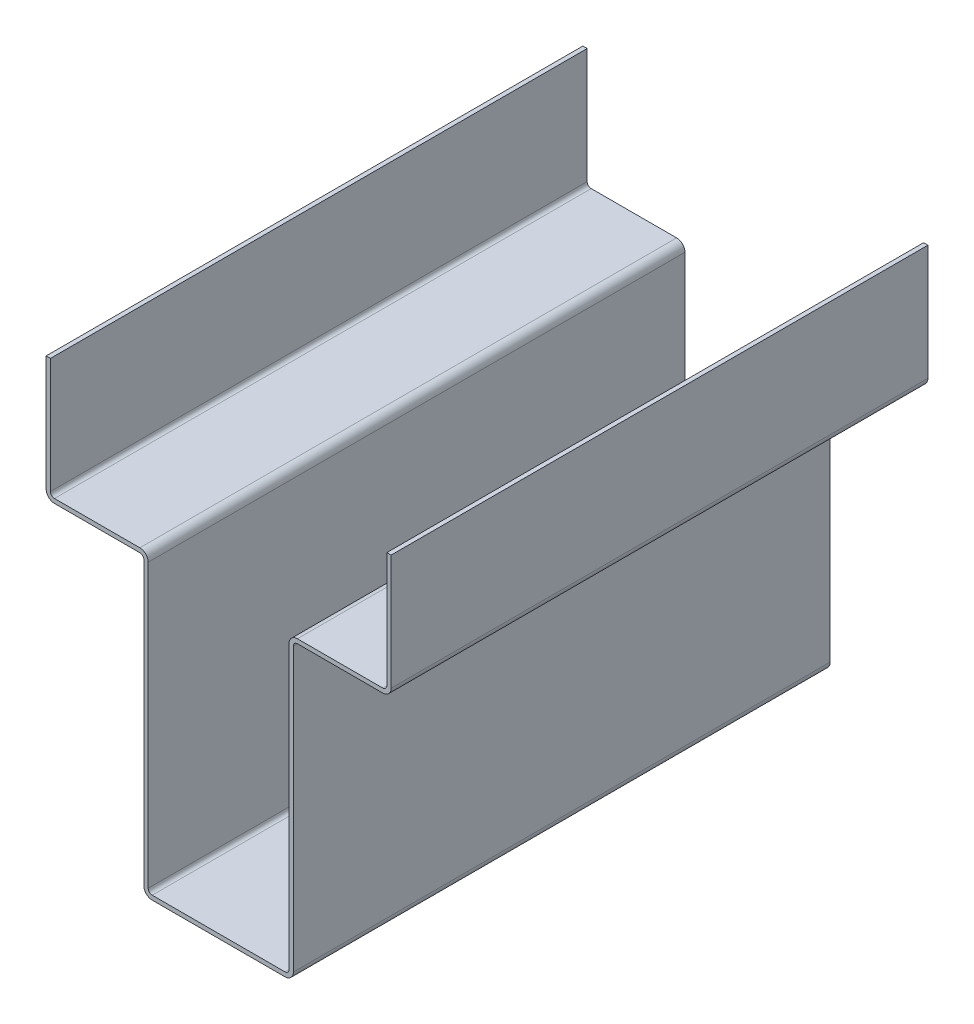
ISO-10303-21;
HEADER;
FILE_DESCRIPTION(('STEP AP214'),'2;1');
FILE_NAME('part.step','',(''),(''),'','','');
FILE_SCHEMA(('AUTOMOTIVE_DESIGN { 1 0 10303 214 1 1 1 1 }'));
ENDSEC;
DATA;
#1=APPLICATION_CONTEXT('core data for automotive mechanical design processes');
#2=APPLICATION_PROTOCOL_DEFINITION('international standard','automotive_design',2000,#1);
#3=PRODUCT_CONTEXT('',#1,'mechanical');
#4=PRODUCT('Part','Part','',(#3));
#5=PRODUCT_RELATED_PRODUCT_CATEGORY('part','',(#4));
#6=PRODUCT_DEFINITION_FORMATION('','',#4);
#7=PRODUCT_DEFINITION_CONTEXT('part definition',#1,'design');
#8=PRODUCT_DEFINITION('design','',#6,#7);
#9=PRODUCT_DEFINITION_SHAPE('','',#8);
#10=(LENGTH_UNIT() NAMED_UNIT(*) SI_UNIT(.MILLI.,.METRE.));
#11=(NAMED_UNIT(*) PLANE_ANGLE_UNIT() SI_UNIT($,.RADIAN.));
#12=(NAMED_UNIT(*) SI_UNIT($,.STERADIAN.) SOLID_ANGLE_UNIT());
#13=UNCERTAINTY_MEASURE_WITH_UNIT(LENGTH_MEASURE(1.E-05),#10,'distance_accuracy_value','');
#14=(GEOMETRIC_REPRESENTATION_CONTEXT(3) GLOBAL_UNCERTAINTY_ASSIGNED_CONTEXT((#13)) GLOBAL_UNIT_ASSIGNED_CONTEXT((#10,
#11,#12)) REPRESENTATION_CONTEXT('',''));
#15=CARTESIAN_POINT('',(0.,0.,0.));
#16=DIRECTION('',(0.,0.,1.));
#17=DIRECTION('',(1.,0.,0.));
#18=AXIS2_PLACEMENT_3D('',#15,#16,#17);
#19=CARTESIAN_POINT('',(58.5,146.302,97.084));
#20=DIRECTION('',(1.,0.,0.));
#21=DIRECTION('',(0.,-1.,0.));
#22=AXIS2_PLACEMENT_3D('',#19,#20,#21);
#23=PLANE('',#22);
#24=DIRECTION('',(0.,-1.,0.));
#25=VECTOR('',#24,1.);
#26=CARTESIAN_POINT('',(58.5000000000028,125.45,93.35));
#27=LINE('',#26,#25);
#28=CARTESIAN_POINT('',(58.5000000000028,145.5,93.35));
#29=VERTEX_POINT('',#28);
#30=CARTESIAN_POINT('',(58.5000000000014,105.400000000002,93.3499999999999));
#31=VERTEX_POINT('',#30);
#32=EDGE_CURVE('E218',#29,#31,#27,.T.);
#33=ORIENTED_EDGE('',*,*,#32,.F.);
#34=DIRECTION('',(0.,0.,1.));
#35=VECTOR('',#34,1.);
#36=CARTESIAN_POINT('',(58.5000000000028,145.5,0.));
#37=LINE('',#36,#35);
#38=CARTESIAN_POINT('',(58.5000000000028,145.5,-93.35));
#39=VERTEX_POINT('',#38);
#40=EDGE_CURVE('E204',#39,#29,#37,.T.);
#41=ORIENTED_EDGE('',*,*,#40,.F.);
#42=DIRECTION('',(0.,-1.,0.));
#43=VECTOR('',#42,1.);
#44=CARTESIAN_POINT('',(58.5000000000028,125.45,-93.35));
#45=LINE('',#44,#43);
#46=CARTESIAN_POINT('',(58.5000000000014,105.400000000002,-93.3499999999971));
#47=VERTEX_POINT('',#46);
#48=EDGE_CURVE('E199',#39,#47,#45,.T.);
#49=ORIENTED_EDGE('',*,*,#48,.T.);
#50=DIRECTION('',(0.,0.,-1.));
#51=VECTOR('',#50,1.);
#52=CARTESIAN_POINT('',(58.5,105.4,0.));
#53=LINE('',#52,#51);
#54=EDGE_CURVE('E202',#31,#47,#53,.T.);
#55=ORIENTED_EDGE('',*,*,#54,.F.);
#56=EDGE_LOOP('',(#33,#41,#49,#55));
#57=FACE_BOUND('',#56,.T.);
#58=ADVANCED_FACE('F16',(#57),#23,.F.);
#59=CARTESIAN_POINT('',(58.18154265341,145.5,-97.084));
#60=DIRECTION('',(0.,1.,0.));
#61=DIRECTION('',(0.,0.,1.));
#62=AXIS2_PLACEMENT_3D('',#59,#60,#61);
#63=PLANE('',#62);
#64=ORIENTED_EDGE('',*,*,#40,.T.);
#65=DIRECTION('',(-1.,0.,0.));
#66=VECTOR('',#65,1.);
#67=CARTESIAN_POINT('',(59.25,145.5,93.35));
#68=LINE('',#67,#66);
#69=CARTESIAN_POINT('',(60.,145.5,93.35));
#70=VERTEX_POINT('',#69);
#71=EDGE_CURVE('E312',#70,#29,#68,.T.);
#72=ORIENTED_EDGE('',*,*,#71,.F.);
#73=DIRECTION('',(0.,0.,1.));
#74=VECTOR('',#73,1.);
#75=CARTESIAN_POINT('',(60.,145.5,0.));
#76=LINE('',#75,#74);
#77=CARTESIAN_POINT('',(60.,145.5,-93.35));
#78=VERTEX_POINT('',#77);
#79=EDGE_CURVE('E228',#78,#70,#76,.T.);
#80=ORIENTED_EDGE('',*,*,#79,.F.);
#81=DIRECTION('',(-1.,0.,0.));
#82=VECTOR('',#81,1.);
#83=CARTESIAN_POINT('',(59.25,145.5,-93.35));
#84=LINE('',#83,#82);
#85=EDGE_CURVE('E208',#78,#39,#84,.T.);
#86=ORIENTED_EDGE('',*,*,#85,.T.);
#87=EDGE_LOOP('',(#64,#72,#80,#86));
#88=FACE_BOUND('',#87,.T.);
#89=ADVANCED_FACE('F502',(#88),#63,.T.);
#90=CARTESIAN_POINT('',(57.1,105.4,93.3499999999999));
#91=DIRECTION('',(0.,0.,-1.));
#92=DIRECTION('',(-1.,0.,0.));
#93=AXIS2_PLACEMENT_3D('',#90,#91,#92);
#94=CYLINDRICAL_SURFACE('',#93,1.4);
#95=CARTESIAN_POINT('',(57.1,105.4,93.3499999999999));
#96=DIRECTION('',(0.,0.,-1.));
#97=DIRECTION('',(-1.,0.,0.));
#98=AXIS2_PLACEMENT_3D('',#95,#96,#97);
#99=CIRCLE('',#98,1.4);
#100=CARTESIAN_POINT('',(57.1000000000021,104.000000000002,93.3499999999999));
#101=VERTEX_POINT('',#100);
#102=EDGE_CURVE('E217',#31,#101,#99,.T.);
#103=ORIENTED_EDGE('',*,*,#102,.F.);
#104=ORIENTED_EDGE('',*,*,#54,.T.);
#105=CARTESIAN_POINT('',(57.1,105.4,-93.3499999999941));
#106=DIRECTION('',(0.,0.,-1.));
#107=DIRECTION('',(-1.,0.,0.));
#108=AXIS2_PLACEMENT_3D('',#105,#106,#107);
#109=CIRCLE('',#108,1.4);
#110=CARTESIAN_POINT('',(57.1,104.000000000002,-93.3499999999971));
#111=VERTEX_POINT('',#110);
#112=EDGE_CURVE('E20',#47,#111,#109,.T.);
#113=ORIENTED_EDGE('',*,*,#112,.T.);
#114=DIRECTION('',(0.,0.,1.));
#115=VECTOR('',#114,1.);
#116=CARTESIAN_POINT('',(57.1,104.,0.));
#117=LINE('',#116,#115);
#118=EDGE_CURVE('E339',#111,#101,#117,.T.);
#119=ORIENTED_EDGE('',*,*,#118,.T.);
#120=EDGE_LOOP('',(#103,#104,#113,#119));
#121=FACE_BOUND('',#120,.T.);
#122=ADVANCED_FACE('F213',(#121),#94,.F.);
#123=CARTESIAN_POINT('',(60.,146.302,97.084));
#124=DIRECTION('',(1.,0.,0.));
#125=DIRECTION('',(0.,-1.,0.));
#126=AXIS2_PLACEMENT_3D('',#123,#124,#125);
#127=PLANE('',#126);
#128=DIRECTION('',(0.,-1.,0.));
#129=VECTOR('',#128,1.);
#130=CARTESIAN_POINT('',(60.,125.45,93.35));
#131=LINE('',#130,#129);
#132=CARTESIAN_POINT('',(60.,105.400000000002,93.3499999999999));
#133=VERTEX_POINT('',#132);
#134=EDGE_CURVE('E325',#70,#133,#131,.T.);
#135=ORIENTED_EDGE('',*,*,#134,.T.);
#136=DIRECTION('',(0.,0.,-1.));
#137=VECTOR('',#136,1.);
#138=CARTESIAN_POINT('',(60.,105.4,0.));
#139=LINE('',#138,#137);
#140=CARTESIAN_POINT('',(60.,105.400000000002,-93.349999999997));
#141=VERTEX_POINT('',#140);
#142=EDGE_CURVE('E235',#133,#141,#139,.T.);
#143=ORIENTED_EDGE('',*,*,#142,.T.);
#144=DIRECTION('',(0.,1.,0.));
#145=VECTOR('',#144,1.);
#146=CARTESIAN_POINT('',(60.,125.45,-93.35));
#147=LINE('',#146,#145);
#148=EDGE_CURVE('E225',#141,#78,#147,.T.);
#149=ORIENTED_EDGE('',*,*,#148,.T.);
#150=ORIENTED_EDGE('',*,*,#79,.T.);
#151=EDGE_LOOP('',(#135,#143,#149,#150));
#152=FACE_BOUND('',#151,.T.);
#153=ADVANCED_FACE('F499',(#152),#127,.T.);
#154=CARTESIAN_POINT('',(57.694,104.,97.084));
#155=DIRECTION('',(0.,-1.,0.));
#156=DIRECTION('',(-1.,0.,0.));
#157=AXIS2_PLACEMENT_3D('',#154,#155,#156);
#158=PLANE('',#157);
#159=DIRECTION('',(-1.,0.,0.));
#160=VECTOR('',#159,1.);
#161=CARTESIAN_POINT('',(42.25,104.000000000004,93.35));
#162=LINE('',#161,#160);
#163=CARTESIAN_POINT('',(27.4000000000004,104.000000000002,93.3499999999999));
#164=VERTEX_POINT('',#163);
#165=EDGE_CURVE('E334',#101,#164,#162,.T.);
#166=ORIENTED_EDGE('',*,*,#165,.F.);
#167=ORIENTED_EDGE('',*,*,#118,.F.);
#168=DIRECTION('',(-1.,0.,0.));
#169=VECTOR('',#168,1.);
#170=CARTESIAN_POINT('',(42.25,104.000000000004,-93.35));
#171=LINE('',#170,#169);
#172=CARTESIAN_POINT('',(27.3999999999984,104.000000000002,-93.3499999999971));
#173=VERTEX_POINT('',#172);
#174=EDGE_CURVE('E224',#111,#173,#171,.T.);
#175=ORIENTED_EDGE('',*,*,#174,.T.);
#176=DIRECTION('',(0.,0.,1.));
#177=VECTOR('',#176,1.);
#178=CARTESIAN_POINT('',(27.4000000000009,104.,0.));
#179=LINE('',#178,#177);
#180=EDGE_CURVE('E239',#173,#164,#179,.T.);
#181=ORIENTED_EDGE('',*,*,#180,.T.);
#182=EDGE_LOOP('',(#166,#167,#175,#181));
#183=FACE_BOUND('',#182,.T.);
#184=ADVANCED_FACE('F557',(#183),#158,.F.);
#185=CARTESIAN_POINT('',(57.1,105.4,93.3499999999999));
#186=DIRECTION('',(0.,0.,-1.));
#187=DIRECTION('',(-1.,0.,0.));
#188=AXIS2_PLACEMENT_3D('',#185,#186,#187);
#189=CYLINDRICAL_SURFACE('',#188,2.89999999999999);
#190=CARTESIAN_POINT('',(57.1,105.4,93.3499999999999));
#191=DIRECTION('',(0.,0.,-1.));
#192=DIRECTION('',(-1.,0.,0.));
#193=AXIS2_PLACEMENT_3D('',#190,#191,#192);
#194=CIRCLE('',#193,2.89999999999999);
#195=CARTESIAN_POINT('',(57.1000000000021,102.5,93.3499999999999));
#196=VERTEX_POINT('',#195);
#197=EDGE_CURVE('E233',#196,#133,#194,.F.);
#198=ORIENTED_EDGE('',*,*,#197,.F.);
#199=DIRECTION('',(0.,0.,1.));
#200=VECTOR('',#199,1.);
#201=CARTESIAN_POINT('',(57.1,102.5,0.));
#202=LINE('',#201,#200);
#203=CARTESIAN_POINT('',(57.1,102.5,-93.3499999999971));
#204=VERTEX_POINT('',#203);
#205=EDGE_CURVE('E343',#204,#196,#202,.T.);
#206=ORIENTED_EDGE('',*,*,#205,.F.);
#207=CARTESIAN_POINT('',(57.1,105.4,-93.3499999999941));
#208=DIRECTION('',(0.,0.,-1.));
#209=DIRECTION('',(-1.,0.,0.));
#210=AXIS2_PLACEMENT_3D('',#207,#208,#209);
#211=CIRCLE('',#210,2.89999999999999);
#212=EDGE_CURVE('E231',#141,#204,#211,.T.);
#213=ORIENTED_EDGE('',*,*,#212,.F.);
#214=ORIENTED_EDGE('',*,*,#142,.F.);
#215=EDGE_LOOP('',(#198,#206,#213,#214));
#216=FACE_BOUND('',#215,.T.);
#217=ADVANCED_FACE('F496',(#216),#189,.T.);
#218=CARTESIAN_POINT('',(27.4,101.1,93.3499999999999));
#219=DIRECTION('',(0.,0.,-1.));
#220=DIRECTION('',(-1.,0.,0.));
#221=AXIS2_PLACEMENT_3D('',#218,#219,#220);
#222=CYLINDRICAL_SURFACE('',#221,2.89999999999999);
#223=CARTESIAN_POINT('',(27.4,101.1,93.3499999999999));
#224=DIRECTION('',(0.,0.,-1.));
#225=DIRECTION('',(-1.,0.,0.));
#226=AXIS2_PLACEMENT_3D('',#223,#224,#225);
#227=CIRCLE('',#226,2.89999999999999);
#228=CARTESIAN_POINT('',(24.5000000000014,101.099999999998,93.3499999999999));
#229=VERTEX_POINT('',#228);
#230=EDGE_CURVE('E240',#164,#229,#227,.F.);
#231=ORIENTED_EDGE('',*,*,#230,.F.);
#232=ORIENTED_EDGE('',*,*,#180,.F.);
#233=CARTESIAN_POINT('',(27.4,101.1,-93.3499999999941));
#234=DIRECTION('',(0.,0.,-1.));
#235=DIRECTION('',(-1.,0.,0.));
#236=AXIS2_PLACEMENT_3D('',#233,#234,#235);
#237=CIRCLE('',#236,2.89999999999999);
#238=CARTESIAN_POINT('',(24.5000000000014,101.1,-93.3499999999971));
#239=VERTEX_POINT('',#238);
#240=EDGE_CURVE('E236',#173,#239,#237,.F.);
#241=ORIENTED_EDGE('',*,*,#240,.T.);
#242=DIRECTION('',(0.,0.,1.));
#243=VECTOR('',#242,1.);
#244=CARTESIAN_POINT('',(24.5,101.1,0.));
#245=LINE('',#244,#243);
#246=EDGE_CURVE('E243',#239,#229,#245,.T.);
#247=ORIENTED_EDGE('',*,*,#246,.T.);
#248=EDGE_LOOP('',(#231,#232,#241,#247));
#249=FACE_BOUND('',#248,.T.);
#250=ADVANCED_FACE('F556',(#249),#222,.T.);
#251=CARTESIAN_POINT('',(57.694,102.5,97.084));
#252=DIRECTION('',(0.,-1.,0.));
#253=DIRECTION('',(-1.,0.,0.));
#254=AXIS2_PLACEMENT_3D('',#251,#252,#253);
#255=PLANE('',#254);
#256=DIRECTION('',(-1.,0.,0.));
#257=VECTOR('',#256,1.);
#258=CARTESIAN_POINT('',(42.25,102.5,93.35));
#259=LINE('',#258,#257);
#260=CARTESIAN_POINT('',(27.4000000000002,102.5,93.3499999999999));
#261=VERTEX_POINT('',#260);
#262=EDGE_CURVE('E244',#196,#261,#259,.T.);
#263=ORIENTED_EDGE('',*,*,#262,.T.);
#264=DIRECTION('',(0.,0.,1.));
#265=VECTOR('',#264,1.);
#266=CARTESIAN_POINT('',(27.4000000000004,102.5,0.));
#267=LINE('',#266,#265);
#268=CARTESIAN_POINT('',(27.3999999999981,102.5,-93.349999999997));
#269=VERTEX_POINT('',#268);
#270=EDGE_CURVE('E248',#269,#261,#267,.T.);
#271=ORIENTED_EDGE('',*,*,#270,.F.);
#272=DIRECTION('',(1.,0.,0.));
#273=VECTOR('',#272,1.);
#274=CARTESIAN_POINT('',(42.25,102.5,-93.35));
#275=LINE('',#274,#273);
#276=EDGE_CURVE('E238',#269,#204,#275,.T.);
#277=ORIENTED_EDGE('',*,*,#276,.T.);
#278=ORIENTED_EDGE('',*,*,#205,.T.);
#279=EDGE_LOOP('',(#263,#271,#277,#278));
#280=FACE_BOUND('',#279,.T.);
#281=ADVANCED_FACE('F493',(#280),#255,.T.);
#282=CARTESIAN_POINT('',(24.5,103.064,97.084));
#283=DIRECTION('',(1.,0.,0.));
#284=DIRECTION('',(0.,-1.,0.));
#285=AXIS2_PLACEMENT_3D('',#282,#283,#284);
#286=PLANE('',#285);
#287=DIRECTION('',(0.,-1.,0.));
#288=VECTOR('',#287,1.);
#289=CARTESIAN_POINT('',(24.5000000000028,52.,93.35));
#290=LINE('',#289,#288);
#291=CARTESIAN_POINT('',(24.5000000000014,2.89999999999952,93.3499999999999));
#292=VERTEX_POINT('',#291);
#293=EDGE_CURVE('E252',#229,#292,#290,.T.);
#294=ORIENTED_EDGE('',*,*,#293,.F.);
#295=ORIENTED_EDGE('',*,*,#246,.F.);
#296=DIRECTION('',(0.,-1.,0.));
#297=VECTOR('',#296,1.);
#298=CARTESIAN_POINT('',(24.5000000000028,52.,-93.35));
#299=LINE('',#298,#297);
#300=CARTESIAN_POINT('',(24.5000000000014,2.89999999999952,-93.3499999999971));
#301=VERTEX_POINT('',#300);
#302=EDGE_CURVE('E249',#239,#301,#299,.T.);
#303=ORIENTED_EDGE('',*,*,#302,.T.);
#304=DIRECTION('',(0.,0.,-1.));
#305=VECTOR('',#304,1.);
#306=CARTESIAN_POINT('',(24.5,2.9,0.));
#307=LINE('',#306,#305);
#308=EDGE_CURVE('E256',#292,#301,#307,.T.);
#309=ORIENTED_EDGE('',*,*,#308,.F.);
#310=EDGE_LOOP('',(#294,#295,#303,#309));
#311=FACE_BOUND('',#310,.T.);
#312=ADVANCED_FACE('F550',(#311),#286,.F.);
#313=CARTESIAN_POINT('',(27.4,101.1,93.3499999999999));
#314=DIRECTION('',(0.,0.,-1.));
#315=DIRECTION('',(-1.,0.,0.));
#316=AXIS2_PLACEMENT_3D('',#313,#314,#315);
#317=CYLINDRICAL_SURFACE('',#316,1.4);
#318=CARTESIAN_POINT('',(27.4,101.1,93.3499999999999));
#319=DIRECTION('',(0.,0.,-1.));
#320=DIRECTION('',(-1.,0.,0.));
#321=AXIS2_PLACEMENT_3D('',#318,#319,#320);
#322=CIRCLE('',#321,1.4);
#323=CARTESIAN_POINT('',(26.,101.099999999998,93.3499999999999));
#324=VERTEX_POINT('',#323);
#325=EDGE_CURVE('E250',#261,#324,#322,.F.);
#326=ORIENTED_EDGE('',*,*,#325,.T.);
#327=DIRECTION('',(0.,0.,1.));
#328=VECTOR('',#327,1.);
#329=CARTESIAN_POINT('',(26.,101.1,0.));
#330=LINE('',#329,#328);
#331=CARTESIAN_POINT('',(26.,101.1,-93.3499999999971));
#332=VERTEX_POINT('',#331);
#333=EDGE_CURVE('E360',#332,#324,#330,.T.);
#334=ORIENTED_EDGE('',*,*,#333,.F.);
#335=CARTESIAN_POINT('',(27.4,101.1,-93.3499999999941));
#336=DIRECTION('',(0.,0.,-1.));
#337=DIRECTION('',(-1.,0.,0.));
#338=AXIS2_PLACEMENT_3D('',#335,#336,#337);
#339=CIRCLE('',#338,1.4);
#340=EDGE_CURVE('E245',#332,#269,#339,.T.);
#341=ORIENTED_EDGE('',*,*,#340,.T.);
#342=ORIENTED_EDGE('',*,*,#270,.T.);
#343=EDGE_LOOP('',(#326,#334,#341,#342));
#344=FACE_BOUND('',#343,.T.);
#345=ADVANCED_FACE('F488',(#344),#317,.F.);
#346=CARTESIAN_POINT('',(23.1,2.9,93.3499999999999));
#347=DIRECTION('',(0.,0.,-1.));
#348=DIRECTION('',(-1.,0.,0.));
#349=AXIS2_PLACEMENT_3D('',#346,#347,#348);
#350=CYLINDRICAL_SURFACE('',#349,1.4);
#351=CARTESIAN_POINT('',(23.1,2.9,93.3499999999999));
#352=DIRECTION('',(0.,0.,-1.));
#353=DIRECTION('',(-1.,0.,0.));
#354=AXIS2_PLACEMENT_3D('',#351,#352,#353);
#355=CIRCLE('',#354,1.4);
#356=CARTESIAN_POINT('',(23.1000000000021,1.49999999999996,93.3499999999999));
#357=VERTEX_POINT('',#356);
#358=EDGE_CURVE('E255',#292,#357,#355,.T.);
#359=ORIENTED_EDGE('',*,*,#358,.F.);
#360=ORIENTED_EDGE('',*,*,#308,.T.);
#361=CARTESIAN_POINT('',(23.1,2.9,-93.3499999999941));
#362=DIRECTION('',(0.,0.,-1.));
#363=DIRECTION('',(-1.,0.,0.));
#364=AXIS2_PLACEMENT_3D('',#361,#362,#363);
#365=CIRCLE('',#364,1.4);
#366=CARTESIAN_POINT('',(23.1,1.49999999999994,-93.3499999999971));
#367=VERTEX_POINT('',#366);
#368=EDGE_CURVE('E253',#301,#367,#365,.T.);
#369=ORIENTED_EDGE('',*,*,#368,.T.);
#370=DIRECTION('',(0.,0.,1.));
#371=VECTOR('',#370,1.);
#372=CARTESIAN_POINT('',(23.1,1.5,0.));
#373=LINE('',#372,#371);
#374=EDGE_CURVE('E371',#367,#357,#373,.T.);
#375=ORIENTED_EDGE('',*,*,#374,.T.);
#376=EDGE_LOOP('',(#359,#360,#369,#375));
#377=FACE_BOUND('',#376,.T.);
#378=ADVANCED_FACE('F549',(#377),#350,.F.);
#379=CARTESIAN_POINT('',(26.,103.064,97.084));
#380=DIRECTION('',(1.,0.,0.));
#381=DIRECTION('',(0.,-1.,0.));
#382=AXIS2_PLACEMENT_3D('',#379,#380,#381);
#383=PLANE('',#382);
#384=DIRECTION('',(0.,-1.,0.));
#385=VECTOR('',#384,1.);
#386=CARTESIAN_POINT('',(26.,52.,93.35));
#387=LINE('',#386,#385);
#388=CARTESIAN_POINT('',(26.,2.89999999999952,93.3499999999999));
#389=VERTEX_POINT('',#388);
#390=EDGE_CURVE('E363',#324,#389,#387,.T.);
#391=ORIENTED_EDGE('',*,*,#390,.T.);
#392=DIRECTION('',(0.,0.,-1.));
#393=VECTOR('',#392,1.);
#394=CARTESIAN_POINT('',(26.,2.9,0.));
#395=LINE('',#394,#393);
#396=CARTESIAN_POINT('',(26.,2.89999999999952,-93.349999999997));
#397=VERTEX_POINT('',#396);
#398=EDGE_CURVE('E265',#389,#397,#395,.T.);
#399=ORIENTED_EDGE('',*,*,#398,.T.);
#400=DIRECTION('',(0.,1.,0.));
#401=VECTOR('',#400,1.);
#402=CARTESIAN_POINT('',(26.,52.,-93.35));
#403=LINE('',#402,#401);
#404=EDGE_CURVE('E259',#397,#332,#403,.T.);
#405=ORIENTED_EDGE('',*,*,#404,.T.);
#406=ORIENTED_EDGE('',*,*,#333,.T.);
#407=EDGE_LOOP('',(#391,#399,#405,#406));
#408=FACE_BOUND('',#407,.T.);
#409=ADVANCED_FACE('F482',(#408),#383,.T.);
#410=CARTESIAN_POINT('',(24.024,1.5,97.084));
#411=DIRECTION('',(0.,-1.,0.));
#412=DIRECTION('',(-1.,0.,0.));
#413=AXIS2_PLACEMENT_3D('',#410,#411,#412);
#414=PLANE('',#413);
#415=DIRECTION('',(-1.,0.,0.));
#416=VECTOR('',#415,1.);
#417=CARTESIAN_POINT('',(0.,1.49999999999993,93.35));
#418=LINE('',#417,#416);
#419=CARTESIAN_POINT('',(-23.1000000000021,1.49999999999993,93.3499999999999));
#420=VERTEX_POINT('',#419);
#421=EDGE_CURVE('E368',#357,#420,#418,.T.);
#422=ORIENTED_EDGE('',*,*,#421,.F.);
#423=ORIENTED_EDGE('',*,*,#374,.F.);
#424=DIRECTION('',(-1.,0.,0.));
#425=VECTOR('',#424,1.);
#426=CARTESIAN_POINT('',(0.,1.49999999999993,-93.35));
#427=LINE('',#426,#425);
#428=CARTESIAN_POINT('',(-23.1000000000021,1.49999999999993,-93.3499999999971));
#429=VERTEX_POINT('',#428);
#430=EDGE_CURVE('E263',#367,#429,#427,.T.);
#431=ORIENTED_EDGE('',*,*,#430,.T.);
#432=DIRECTION('',(0.,0.,-1.));
#433=VECTOR('',#432,1.);
#434=CARTESIAN_POINT('',(-23.1000000000001,1.5,0.));
#435=LINE('',#434,#433);
#436=EDGE_CURVE('E269',#420,#429,#435,.T.);
#437=ORIENTED_EDGE('',*,*,#436,.F.);
#438=EDGE_LOOP('',(#422,#423,#431,#437));
#439=FACE_BOUND('',#438,.T.);
#440=ADVANCED_FACE('F543',(#439),#414,.F.);
#441=CARTESIAN_POINT('',(23.1,2.9,93.3499999999999));
#442=DIRECTION('',(0.,0.,-1.));
#443=DIRECTION('',(-1.,0.,0.));
#444=AXIS2_PLACEMENT_3D('',#441,#442,#443);
#445=CYLINDRICAL_SURFACE('',#444,2.90000000000001);
#446=CARTESIAN_POINT('',(23.1,2.9,93.3499999999999));
#447=DIRECTION('',(0.,0.,-1.));
#448=DIRECTION('',(-1.,0.,0.));
#449=AXIS2_PLACEMENT_3D('',#446,#447,#448);
#450=CIRCLE('',#449,2.90000000000001);
#451=CARTESIAN_POINT('',(23.1000000000021,0.,93.3499999999999));
#452=VERTEX_POINT('',#451);
#453=EDGE_CURVE('E262',#452,#389,#450,.F.);
#454=ORIENTED_EDGE('',*,*,#453,.F.);
#455=DIRECTION('',(0.,0.,1.));
#456=VECTOR('',#455,1.);
#457=CARTESIAN_POINT('',(23.1,0.,0.));
#458=LINE('',#457,#456);
#459=CARTESIAN_POINT('',(23.1,0.,-93.3499999999971));
#460=VERTEX_POINT('',#459);
#461=EDGE_CURVE('E379',#460,#452,#458,.T.);
#462=ORIENTED_EDGE('',*,*,#461,.F.);
#463=CARTESIAN_POINT('',(23.1,2.9,-93.3499999999941));
#464=DIRECTION('',(0.,0.,-1.));
#465=DIRECTION('',(-1.,0.,0.));
#466=AXIS2_PLACEMENT_3D('',#463,#464,#465);
#467=CIRCLE('',#466,2.90000000000001);
#468=EDGE_CURVE('E260',#397,#460,#467,.T.);
#469=ORIENTED_EDGE('',*,*,#468,.F.);
#470=ORIENTED_EDGE('',*,*,#398,.F.);
#471=EDGE_LOOP('',(#454,#462,#469,#470));
#472=FACE_BOUND('',#471,.T.);
#473=ADVANCED_FACE('F485',(#472),#445,.T.);
#474=CARTESIAN_POINT('',(-23.1,2.9,93.3499999999999));
#475=DIRECTION('',(0.,0.,-1.));
#476=DIRECTION('',(-1.,0.,0.));
#477=AXIS2_PLACEMENT_3D('',#474,#475,#476);
#478=CYLINDRICAL_SURFACE('',#477,1.4);
#479=CARTESIAN_POINT('',(-23.1,2.9,93.3499999999999));
#480=DIRECTION('',(0.,0.,-1.));
#481=DIRECTION('',(-1.,0.,0.));
#482=AXIS2_PLACEMENT_3D('',#479,#480,#481);
#483=CIRCLE('',#482,1.4);
#484=CARTESIAN_POINT('',(-24.5000000000014,2.89999999999952,93.3499999999999));
#485=VERTEX_POINT('',#484);
#486=EDGE_CURVE('E268',#420,#485,#483,.T.);
#487=ORIENTED_EDGE('',*,*,#486,.F.);
#488=ORIENTED_EDGE('',*,*,#436,.T.);
#489=CARTESIAN_POINT('',(-23.1,2.9,-93.3499999999941));
#490=DIRECTION('',(0.,0.,-1.));
#491=DIRECTION('',(-1.,0.,0.));
#492=AXIS2_PLACEMENT_3D('',#489,#490,#491);
#493=CIRCLE('',#492,1.4);
#494=CARTESIAN_POINT('',(-24.5000000000014,2.9,-93.3499999999971));
#495=VERTEX_POINT('',#494);
#496=EDGE_CURVE('E266',#429,#495,#493,.T.);
#497=ORIENTED_EDGE('',*,*,#496,.T.);
#498=DIRECTION('',(0.,0.,1.));
#499=VECTOR('',#498,1.);
#500=CARTESIAN_POINT('',(-24.5,2.9,0.));
#501=LINE('',#500,#499);
#502=EDGE_CURVE('E390',#495,#485,#501,.T.);
#503=ORIENTED_EDGE('',*,*,#502,.T.);
#504=EDGE_LOOP('',(#487,#488,#497,#503));
#505=FACE_BOUND('',#504,.T.);
#506=ADVANCED_FACE('F542',(#505),#478,.F.);
#507=CARTESIAN_POINT('',(24.024,0.,97.084));
#508=DIRECTION('',(0.,-1.,0.));
#509=DIRECTION('',(-1.,0.,0.));
#510=AXIS2_PLACEMENT_3D('',#507,#508,#509);
#511=PLANE('',#510);
#512=DIRECTION('',(-1.,0.,0.));
#513=VECTOR('',#512,1.);
#514=CARTESIAN_POINT('',(0.,0.,93.35));
#515=LINE('',#514,#513);
#516=CARTESIAN_POINT('',(-23.1000000000021,0.,93.3499999999999));
#517=VERTEX_POINT('',#516);
#518=EDGE_CURVE('E382',#452,#517,#515,.T.);
#519=ORIENTED_EDGE('',*,*,#518,.T.);
#520=DIRECTION('',(0.,0.,-1.));
#521=VECTOR('',#520,1.);
#522=CARTESIAN_POINT('',(-23.1000000000003,0.,0.));
#523=LINE('',#522,#521);
#524=CARTESIAN_POINT('',(-23.1000000000021,0.,-93.349999999997));
#525=VERTEX_POINT('',#524);
#526=EDGE_CURVE('E278',#517,#525,#523,.T.);
#527=ORIENTED_EDGE('',*,*,#526,.T.);
#528=DIRECTION('',(1.,0.,0.));
#529=VECTOR('',#528,1.);
#530=CARTESIAN_POINT('',(0.,0.,-93.35));
#531=LINE('',#530,#529);
#532=EDGE_CURVE('E272',#525,#460,#531,.T.);
#533=ORIENTED_EDGE('',*,*,#532,.T.);
#534=ORIENTED_EDGE('',*,*,#461,.T.);
#535=EDGE_LOOP('',(#519,#527,#533,#534));
#536=FACE_BOUND('',#535,.T.);
#537=ADVANCED_FACE('F475',(#536),#511,.T.);
#538=CARTESIAN_POINT('',(-24.5,0.936,97.084));
#539=DIRECTION('',(-1.,0.,0.));
#540=DIRECTION('',(0.,1.,0.));
#541=AXIS2_PLACEMENT_3D('',#538,#539,#540);
#542=PLANE('',#541);
#543=DIRECTION('',(0.,1.,0.));
#544=VECTOR('',#543,1.);
#545=CARTESIAN_POINT('',(-24.5000000000028,52.,93.35));
#546=LINE('',#545,#544);
#547=CARTESIAN_POINT('',(-24.5000000000014,101.099999999999,93.3499999999999));
#548=VERTEX_POINT('',#547);
#549=EDGE_CURVE('E387',#485,#548,#546,.T.);
#550=ORIENTED_EDGE('',*,*,#549,.F.);
#551=ORIENTED_EDGE('',*,*,#502,.F.);
#552=DIRECTION('',(0.,1.,0.));
#553=VECTOR('',#552,1.);
#554=CARTESIAN_POINT('',(-24.5000000000028,52.,-93.35));
#555=LINE('',#554,#553);
#556=CARTESIAN_POINT('',(-24.5000000000028,101.099999999998,-93.3499999999971));
#557=VERTEX_POINT('',#556);
#558=EDGE_CURVE('E276',#495,#557,#555,.T.);
#559=ORIENTED_EDGE('',*,*,#558,.T.);
#560=DIRECTION('',(0.,0.,1.));
#561=VECTOR('',#560,1.);
#562=CARTESIAN_POINT('',(-24.5,101.099999999999,0.));
#563=LINE('',#562,#561);
#564=EDGE_CURVE('E282',#557,#548,#563,.T.);
#565=ORIENTED_EDGE('',*,*,#564,.T.);
#566=EDGE_LOOP('',(#550,#551,#559,#565));
#567=FACE_BOUND('',#566,.T.);
#568=ADVANCED_FACE('F536',(#567),#542,.F.);
#569=CARTESIAN_POINT('',(-23.1,2.9,93.3499999999999));
#570=DIRECTION('',(0.,0.,-1.));
#571=DIRECTION('',(-1.,0.,0.));
#572=AXIS2_PLACEMENT_3D('',#569,#570,#571);
#573=CYLINDRICAL_SURFACE('',#572,2.9);
#574=CARTESIAN_POINT('',(-23.1,2.9,93.3499999999999));
#575=DIRECTION('',(0.,0.,-1.));
#576=DIRECTION('',(-1.,0.,0.));
#577=AXIS2_PLACEMENT_3D('',#574,#575,#576);
#578=CIRCLE('',#577,2.9);
#579=CARTESIAN_POINT('',(-26.,2.89999999999952,93.3499999999999));
#580=VERTEX_POINT('',#579);
#581=EDGE_CURVE('E275',#580,#517,#578,.F.);
#582=ORIENTED_EDGE('',*,*,#581,.F.);
#583=DIRECTION('',(0.,0.,1.));
#584=VECTOR('',#583,1.);
#585=CARTESIAN_POINT('',(-26.,2.9,0.));
#586=LINE('',#585,#584);
#587=CARTESIAN_POINT('',(-26.,2.9,-93.3499999999971));
#588=VERTEX_POINT('',#587);
#589=EDGE_CURVE('E396',#588,#580,#586,.T.);
#590=ORIENTED_EDGE('',*,*,#589,.F.);
#591=CARTESIAN_POINT('',(-23.1,2.9,-93.3499999999941));
#592=DIRECTION('',(0.,0.,-1.));
#593=DIRECTION('',(-1.,0.,0.));
#594=AXIS2_PLACEMENT_3D('',#591,#592,#593);
#595=CIRCLE('',#594,2.9);
#596=EDGE_CURVE('E273',#525,#588,#595,.T.);
#597=ORIENTED_EDGE('',*,*,#596,.F.);
#598=ORIENTED_EDGE('',*,*,#526,.F.);
#599=EDGE_LOOP('',(#582,#590,#597,#598));
#600=FACE_BOUND('',#599,.T.);
#601=ADVANCED_FACE('F472',(#600),#573,.T.);
#602=CARTESIAN_POINT('',(-27.4,101.1,93.3499999999999));
#603=DIRECTION('',(0.,0.,-1.));
#604=DIRECTION('',(-1.,0.,0.));
#605=AXIS2_PLACEMENT_3D('',#602,#603,#604);
#606=CYLINDRICAL_SURFACE('',#605,2.90000000000001);
#607=CARTESIAN_POINT('',(-27.4,101.1,93.3499999999999));
#608=DIRECTION('',(0.,0.,-1.));
#609=DIRECTION('',(-1.,0.,0.));
#610=AXIS2_PLACEMENT_3D('',#607,#608,#609);
#611=CIRCLE('',#610,2.90000000000001);
#612=CARTESIAN_POINT('',(-27.3999999999979,104.000000000002,93.3499999999999));
#613=VERTEX_POINT('',#612);
#614=EDGE_CURVE('E283',#548,#613,#611,.F.);
#615=ORIENTED_EDGE('',*,*,#614,.F.);
#616=ORIENTED_EDGE('',*,*,#564,.F.);
#617=CARTESIAN_POINT('',(-27.4,101.1,-93.3499999999941));
#618=DIRECTION('',(0.,0.,-1.));
#619=DIRECTION('',(-1.,0.,0.));
#620=AXIS2_PLACEMENT_3D('',#617,#618,#619);
#621=CIRCLE('',#620,2.90000000000001);
#622=CARTESIAN_POINT('',(-27.4,104.000000000002,-93.3499999999971));
#623=VERTEX_POINT('',#622);
#624=EDGE_CURVE('E279',#557,#623,#621,.F.);
#625=ORIENTED_EDGE('',*,*,#624,.T.);
#626=DIRECTION('',(0.,0.,1.));
#627=VECTOR('',#626,1.);
#628=CARTESIAN_POINT('',(-27.4,104.,0.));
#629=LINE('',#628,#627);
#630=EDGE_CURVE('E286',#623,#613,#629,.T.);
#631=ORIENTED_EDGE('',*,*,#630,.T.);
#632=EDGE_LOOP('',(#615,#616,#625,#631));
#633=FACE_BOUND('',#632,.T.);
#634=ADVANCED_FACE('F535',(#633),#606,.T.);
#635=CARTESIAN_POINT('',(-26.,0.936,97.084));
#636=DIRECTION('',(-1.,0.,0.));
#637=DIRECTION('',(0.,1.,0.));
#638=AXIS2_PLACEMENT_3D('',#635,#636,#637);
#639=PLANE('',#638);
#640=DIRECTION('',(0.,1.,0.));
#641=VECTOR('',#640,1.);
#642=CARTESIAN_POINT('',(-26.,52.,93.35));
#643=LINE('',#642,#641);
#644=CARTESIAN_POINT('',(-26.,101.1,93.3499999999999));
#645=VERTEX_POINT('',#644);
#646=EDGE_CURVE('E287',#580,#645,#643,.T.);
#647=ORIENTED_EDGE('',*,*,#646,.T.);
#648=DIRECTION('',(0.,0.,1.));
#649=VECTOR('',#648,1.);
#650=CARTESIAN_POINT('',(-26.,101.099999999999,0.));
#651=LINE('',#650,#649);
#652=CARTESIAN_POINT('',(-26.,101.099999999998,-93.349999999997));
#653=VERTEX_POINT('',#652);
#654=EDGE_CURVE('E291',#653,#645,#651,.T.);
#655=ORIENTED_EDGE('',*,*,#654,.F.);
#656=DIRECTION('',(0.,-1.,0.));
#657=VECTOR('',#656,1.);
#658=CARTESIAN_POINT('',(-26.,52.,-93.35));
#659=LINE('',#658,#657);
#660=EDGE_CURVE('E281',#653,#588,#659,.T.);
#661=ORIENTED_EDGE('',*,*,#660,.T.);
#662=ORIENTED_EDGE('',*,*,#589,.T.);
#663=EDGE_LOOP('',(#647,#655,#661,#662));
#664=FACE_BOUND('',#663,.T.);
#665=ADVANCED_FACE('F469',(#664),#639,.T.);
#666=CARTESIAN_POINT('',(-26.806,104.,97.084));
#667=DIRECTION('',(0.,-1.,0.));
#668=DIRECTION('',(-1.,0.,0.));
#669=AXIS2_PLACEMENT_3D('',#666,#667,#668);
#670=PLANE('',#669);
#671=DIRECTION('',(-1.,0.,0.));
#672=VECTOR('',#671,1.);
#673=CARTESIAN_POINT('',(-42.25,104.000000000004,93.35));
#674=LINE('',#673,#672);
#675=CARTESIAN_POINT('',(-57.1000000000022,104.000000000002,93.3499999999999));
#676=VERTEX_POINT('',#675);
#677=EDGE_CURVE('E295',#613,#676,#674,.T.);
#678=ORIENTED_EDGE('',*,*,#677,.F.);
#679=ORIENTED_EDGE('',*,*,#630,.F.);
#680=DIRECTION('',(-1.,0.,0.));
#681=VECTOR('',#680,1.);
#682=CARTESIAN_POINT('',(-42.25,104.000000000004,-93.35));
#683=LINE('',#682,#681);
#684=CARTESIAN_POINT('',(-57.1000000000022,104.000000000002,-93.3499999999971));
#685=VERTEX_POINT('',#684);
#686=EDGE_CURVE('E292',#623,#685,#683,.T.);
#687=ORIENTED_EDGE('',*,*,#686,.T.);
#688=DIRECTION('',(0.,0.,-1.));
#689=VECTOR('',#688,1.);
#690=CARTESIAN_POINT('',(-57.1000000000002,104.,0.));
#691=LINE('',#690,#689);
#692=EDGE_CURVE('E299',#676,#685,#691,.T.);
#693=ORIENTED_EDGE('',*,*,#692,.F.);
#694=EDGE_LOOP('',(#678,#679,#687,#693));
#695=FACE_BOUND('',#694,.T.);
#696=ADVANCED_FACE('F529',(#695),#670,.F.);
#697=CARTESIAN_POINT('',(-27.4,101.1,93.3499999999999));
#698=DIRECTION('',(0.,0.,-1.));
#699=DIRECTION('',(-1.,0.,0.));
#700=AXIS2_PLACEMENT_3D('',#697,#698,#699);
#701=CYLINDRICAL_SURFACE('',#700,1.4);
#702=CARTESIAN_POINT('',(-27.4,101.1,93.3499999999999));
#703=DIRECTION('',(0.,0.,-1.));
#704=DIRECTION('',(-1.,0.,0.));
#705=AXIS2_PLACEMENT_3D('',#702,#703,#704);
#706=CIRCLE('',#705,1.4);
#707=CARTESIAN_POINT('',(-27.3999999999979,102.5,93.3499999999999));
#708=VERTEX_POINT('',#707);
#709=EDGE_CURVE('E293',#645,#708,#706,.F.);
#710=ORIENTED_EDGE('',*,*,#709,.T.);
#711=DIRECTION('',(0.,0.,1.));
#712=VECTOR('',#711,1.);
#713=CARTESIAN_POINT('',(-27.4,102.5,0.));
#714=LINE('',#713,#712);
#715=CARTESIAN_POINT('',(-27.4,102.5,-93.3499999999971));
#716=VERTEX_POINT('',#715);
#717=EDGE_CURVE('E413',#716,#708,#714,.T.);
#718=ORIENTED_EDGE('',*,*,#717,.F.);
#719=CARTESIAN_POINT('',(-27.4,101.1,-93.3499999999941));
#720=DIRECTION('',(0.,0.,-1.));
#721=DIRECTION('',(-1.,0.,0.));
#722=AXIS2_PLACEMENT_3D('',#719,#720,#721);
#723=CIRCLE('',#722,1.4);
#724=EDGE_CURVE('E288',#716,#653,#723,.T.);
#725=ORIENTED_EDGE('',*,*,#724,.T.);
#726=ORIENTED_EDGE('',*,*,#654,.T.);
#727=EDGE_LOOP('',(#710,#718,#725,#726));
#728=FACE_BOUND('',#727,.T.);
#729=ADVANCED_FACE('F464',(#728),#701,.F.);
#730=CARTESIAN_POINT('',(-57.1,105.4,93.3499999999999));
#731=DIRECTION('',(0.,0.,-1.));
#732=DIRECTION('',(-1.,0.,0.));
#733=AXIS2_PLACEMENT_3D('',#730,#731,#732);
#734=CYLINDRICAL_SURFACE('',#733,1.4);
#735=CARTESIAN_POINT('',(-57.1,105.4,93.3499999999999));
#736=DIRECTION('',(0.,0.,-1.));
#737=DIRECTION('',(-1.,0.,0.));
#738=AXIS2_PLACEMENT_3D('',#735,#736,#737);
#739=CIRCLE('',#738,1.4);
#740=CARTESIAN_POINT('',(-58.5000000000014,105.400000000002,93.3499999999999));
#741=VERTEX_POINT('',#740);
#742=EDGE_CURVE('E298',#676,#741,#739,.T.);
#743=ORIENTED_EDGE('',*,*,#742,.F.);
#744=ORIENTED_EDGE('',*,*,#692,.T.);
#745=CARTESIAN_POINT('',(-57.1,105.4,-93.3499999999941));
#746=DIRECTION('',(0.,0.,-1.));
#747=DIRECTION('',(-1.,0.,0.));
#748=AXIS2_PLACEMENT_3D('',#745,#746,#747);
#749=CIRCLE('',#748,1.4);
#750=CARTESIAN_POINT('',(-58.5000000000014,105.4,-93.3499999999971));
#751=VERTEX_POINT('',#750);
#752=EDGE_CURVE('E296',#685,#751,#749,.T.);
#753=ORIENTED_EDGE('',*,*,#752,.T.);
#754=DIRECTION('',(0.,0.,1.));
#755=VECTOR('',#754,1.);
#756=CARTESIAN_POINT('',(-58.5,105.4,0.));
#757=LINE('',#756,#755);
#758=EDGE_CURVE('E421',#751,#741,#757,.T.);
#759=ORIENTED_EDGE('',*,*,#758,.T.);
#760=EDGE_LOOP('',(#743,#744,#753,#759));
#761=FACE_BOUND('',#760,.T.);
#762=ADVANCED_FACE('F528',(#761),#734,.F.);
#763=CARTESIAN_POINT('',(-26.806,102.5,97.084));
#764=DIRECTION('',(0.,-1.,0.));
#765=DIRECTION('',(-1.,0.,0.));
#766=AXIS2_PLACEMENT_3D('',#763,#764,#765);
#767=PLANE('',#766);
#768=DIRECTION('',(-1.,0.,0.));
#769=VECTOR('',#768,1.);
#770=CARTESIAN_POINT('',(-42.25,102.5,93.35));
#771=LINE('',#770,#769);
#772=CARTESIAN_POINT('',(-57.1000000000021,102.5,93.35));
#773=VERTEX_POINT('',#772);
#774=EDGE_CURVE('E416',#708,#773,#771,.T.);
#775=ORIENTED_EDGE('',*,*,#774,.T.);
#776=DIRECTION('',(0.,0.,-1.));
#777=VECTOR('',#776,1.);
#778=CARTESIAN_POINT('',(-57.1000000000003,102.5,0.));
#779=LINE('',#778,#777);
#780=CARTESIAN_POINT('',(-57.1000000000021,102.5,-93.3499999999985));
#781=VERTEX_POINT('',#780);
#782=EDGE_CURVE('E308',#773,#781,#779,.T.);
#783=ORIENTED_EDGE('',*,*,#782,.T.);
#784=DIRECTION('',(1.,0.,0.));
#785=VECTOR('',#784,1.);
#786=CARTESIAN_POINT('',(-42.25,102.5,-93.35));
#787=LINE('',#786,#785);
#788=EDGE_CURVE('E302',#781,#716,#787,.T.);
#789=ORIENTED_EDGE('',*,*,#788,.T.);
#790=ORIENTED_EDGE('',*,*,#717,.T.);
#791=EDGE_LOOP('',(#775,#783,#789,#790));
#792=FACE_BOUND('',#791,.T.);
#793=ADVANCED_FACE('F458',(#792),#767,.T.);
#794=CARTESIAN_POINT('',(-58.5,104.598,97.084));
#795=DIRECTION('',(-1.,0.,0.));
#796=DIRECTION('',(0.,1.,0.));
#797=AXIS2_PLACEMENT_3D('',#794,#795,#796);
#798=PLANE('',#797);
#799=DIRECTION('',(0.,1.,0.));
#800=VECTOR('',#799,1.);
#801=CARTESIAN_POINT('',(-58.5000000000028,125.45,93.35));
#802=LINE('',#801,#800);
#803=CARTESIAN_POINT('',(-58.5000000000014,145.5,93.35));
#804=VERTEX_POINT('',#803);
#805=EDGE_CURVE('E417',#741,#804,#802,.T.);
#806=ORIENTED_EDGE('',*,*,#805,.F.);
#807=ORIENTED_EDGE('',*,*,#758,.F.);
#808=DIRECTION('',(0.,1.,0.));
#809=VECTOR('',#808,1.);
#810=CARTESIAN_POINT('',(-58.5000000000028,125.45,-93.35));
#811=LINE('',#810,#809);
#812=CARTESIAN_POINT('',(-58.5000000000021,145.5,-93.35));
#813=VERTEX_POINT('',#812);
#814=EDGE_CURVE('E306',#751,#813,#811,.T.);
#815=ORIENTED_EDGE('',*,*,#814,.T.);
#816=DIRECTION('',(0.,0.,1.));
#817=VECTOR('',#816,1.);
#818=CARTESIAN_POINT('',(-58.5000000000028,145.5,0.));
#819=LINE('',#818,#817);
#820=EDGE_CURVE('E440',#813,#804,#819,.T.);
#821=ORIENTED_EDGE('',*,*,#820,.T.);
#822=EDGE_LOOP('',(#806,#807,#815,#821));
#823=FACE_BOUND('',#822,.T.);
#824=ADVANCED_FACE('F444',(#823),#798,.F.);
#825=CARTESIAN_POINT('',(-58.18154265341,104.598,-93.35));
#826=DIRECTION('',(0.,0.,1.));
#827=DIRECTION('',(0.,1.,0.));
#828=AXIS2_PLACEMENT_3D('',#825,#826,#827);
#829=PLANE('',#828);
#830=ORIENTED_EDGE('',*,*,#814,.F.);
#831=ORIENTED_EDGE('',*,*,#752,.F.);
#832=ORIENTED_EDGE('',*,*,#686,.F.);
#833=ORIENTED_EDGE('',*,*,#624,.F.);
#834=ORIENTED_EDGE('',*,*,#558,.F.);
#835=ORIENTED_EDGE('',*,*,#496,.F.);
#836=ORIENTED_EDGE('',*,*,#430,.F.);
#837=ORIENTED_EDGE('',*,*,#368,.F.);
#838=ORIENTED_EDGE('',*,*,#302,.F.);
#839=ORIENTED_EDGE('',*,*,#240,.F.);
#840=ORIENTED_EDGE('',*,*,#174,.F.);
#841=ORIENTED_EDGE('',*,*,#112,.F.);
#842=ORIENTED_EDGE('',*,*,#48,.F.);
#843=ORIENTED_EDGE('',*,*,#85,.F.);
#844=ORIENTED_EDGE('',*,*,#148,.F.);
#845=ORIENTED_EDGE('',*,*,#212,.T.);
#846=ORIENTED_EDGE('',*,*,#276,.F.);
#847=ORIENTED_EDGE('',*,*,#340,.F.);
#848=ORIENTED_EDGE('',*,*,#404,.F.);
#849=ORIENTED_EDGE('',*,*,#468,.T.);
#850=ORIENTED_EDGE('',*,*,#532,.F.);
#851=ORIENTED_EDGE('',*,*,#596,.T.);
#852=ORIENTED_EDGE('',*,*,#660,.F.);
#853=ORIENTED_EDGE('',*,*,#724,.F.);
#854=ORIENTED_EDGE('',*,*,#788,.F.);
#855=CARTESIAN_POINT('',(-57.1,105.4,-93.349999999997));
#856=DIRECTION('',(0.,0.,-1.));
#857=DIRECTION('',(-1.,0.,0.));
#858=AXIS2_PLACEMENT_3D('',#855,#856,#857);
#859=CIRCLE('',#858,2.9);
#860=CARTESIAN_POINT('',(-60.,105.4,-93.3499999999985));
#861=VERTEX_POINT('',#860);
#862=EDGE_CURVE('E303',#781,#861,#859,.T.);
#863=ORIENTED_EDGE('',*,*,#862,.T.);
#864=DIRECTION('',(0.,-1.,0.));
#865=VECTOR('',#864,1.);
#866=CARTESIAN_POINT('',(-60.,125.45,-93.35));
#867=LINE('',#866,#865);
#868=CARTESIAN_POINT('',(-59.9999999999979,145.5,-93.35));
#869=VERTEX_POINT('',#868);
#870=EDGE_CURVE('E424',#869,#861,#867,.T.);
#871=ORIENTED_EDGE('',*,*,#870,.F.);
#872=DIRECTION('',(1.,0.,0.));
#873=VECTOR('',#872,1.);
#874=CARTESIAN_POINT('',(-59.25,145.5,-93.35));
#875=LINE('',#874,#873);
#876=EDGE_CURVE('E419',#869,#813,#875,.T.);
#877=ORIENTED_EDGE('',*,*,#876,.T.);
#878=EDGE_LOOP('',(#830,#831,#832,#833,#834,#835,#836,#837,#838,#839,#840,#841,#842,#843,#844,
#845,#846,#847,#848,#849,#850,#851,#852,#853,#854,#863,#871,#877));
#879=FACE_BOUND('',#878,.T.);
#880=ADVANCED_FACE('F222',(#879),#829,.F.);
#881=CARTESIAN_POINT('',(-57.1,105.4,93.3499999999999));
#882=DIRECTION('',(0.,0.,-1.));
#883=DIRECTION('',(-1.,0.,0.));
#884=AXIS2_PLACEMENT_3D('',#881,#882,#883);
#885=CYLINDRICAL_SURFACE('',#884,2.9);
#886=CARTESIAN_POINT('',(-57.1,105.4,93.3499999999999));
#887=DIRECTION('',(0.,0.,-1.));
#888=DIRECTION('',(-1.,0.,0.));
#889=AXIS2_PLACEMENT_3D('',#886,#887,#888);
#890=CIRCLE('',#889,2.9);
#891=CARTESIAN_POINT('',(-60.,105.400000000002,93.35));
#892=VERTEX_POINT('',#891);
#893=EDGE_CURVE('E305',#892,#773,#890,.F.);
#894=ORIENTED_EDGE('',*,*,#893,.F.);
#895=DIRECTION('',(0.,0.,1.));
#896=VECTOR('',#895,1.);
#897=CARTESIAN_POINT('',(-60.,105.4,0.));
#898=LINE('',#897,#896);
#899=EDGE_CURVE('E427',#861,#892,#898,.T.);
#900=ORIENTED_EDGE('',*,*,#899,.F.);
#901=ORIENTED_EDGE('',*,*,#862,.F.);
#902=ORIENTED_EDGE('',*,*,#782,.F.);
#903=EDGE_LOOP('',(#894,#900,#901,#902));
#904=FACE_BOUND('',#903,.T.);
#905=ADVANCED_FACE('F461',(#904),#885,.T.);
#906=CARTESIAN_POINT('',(-58.18154265341,104.598,93.35));
#907=DIRECTION('',(0.,0.,1.));
#908=DIRECTION('',(0.,1.,0.));
#909=AXIS2_PLACEMENT_3D('',#906,#907,#908);
#910=PLANE('',#909);
#911=ORIENTED_EDGE('',*,*,#805,.T.);
#912=DIRECTION('',(-1.,0.,0.));
#913=VECTOR('',#912,1.);
#914=CARTESIAN_POINT('',(-59.25,145.5,93.35));
#915=LINE('',#914,#913);
#916=CARTESIAN_POINT('',(-59.9999999999979,145.5,93.35));
#917=VERTEX_POINT('',#916);
#918=EDGE_CURVE('E35',#804,#917,#915,.T.);
#919=ORIENTED_EDGE('',*,*,#918,.T.);
#920=DIRECTION('',(0.,1.,0.));
#921=VECTOR('',#920,1.);
#922=CARTESIAN_POINT('',(-60.,125.45,93.35));
#923=LINE('',#922,#921);
#924=EDGE_CURVE('E26',#892,#917,#923,.T.);
#925=ORIENTED_EDGE('',*,*,#924,.F.);
#926=ORIENTED_EDGE('',*,*,#893,.T.);
#927=ORIENTED_EDGE('',*,*,#774,.F.);
#928=ORIENTED_EDGE('',*,*,#709,.F.);
#929=ORIENTED_EDGE('',*,*,#646,.F.);
#930=ORIENTED_EDGE('',*,*,#581,.T.);
#931=ORIENTED_EDGE('',*,*,#518,.F.);
#932=ORIENTED_EDGE('',*,*,#453,.T.);
#933=ORIENTED_EDGE('',*,*,#390,.F.);
#934=ORIENTED_EDGE('',*,*,#325,.F.);
#935=ORIENTED_EDGE('',*,*,#262,.F.);
#936=ORIENTED_EDGE('',*,*,#197,.T.);
#937=ORIENTED_EDGE('',*,*,#134,.F.);
#938=ORIENTED_EDGE('',*,*,#71,.T.);
#939=ORIENTED_EDGE('',*,*,#32,.T.);
#940=ORIENTED_EDGE('',*,*,#102,.T.);
#941=ORIENTED_EDGE('',*,*,#165,.T.);
#942=ORIENTED_EDGE('',*,*,#230,.T.);
#943=ORIENTED_EDGE('',*,*,#293,.T.);
#944=ORIENTED_EDGE('',*,*,#358,.T.);
#945=ORIENTED_EDGE('',*,*,#421,.T.);
#946=ORIENTED_EDGE('',*,*,#486,.T.);
#947=ORIENTED_EDGE('',*,*,#549,.T.);
#948=ORIENTED_EDGE('',*,*,#614,.T.);
#949=ORIENTED_EDGE('',*,*,#677,.T.);
#950=ORIENTED_EDGE('',*,*,#742,.T.);
#951=EDGE_LOOP('',(#911,#919,#925,#926,#927,#928,#929,#930,#931,#932,#933,#934,#935,#936,#937,
#938,#939,#940,#941,#942,#943,#944,#945,#946,#947,#948,#949,#950));
#952=FACE_BOUND('',#951,.T.);
#953=ADVANCED_FACE('F448',(#952),#910,.T.);
#954=CARTESIAN_POINT('',(-58.18154265341,145.5,-97.084));
#955=DIRECTION('',(0.,-1.,0.));
#956=DIRECTION('',(0.,0.,1.));
#957=AXIS2_PLACEMENT_3D('',#954,#955,#956);
#958=PLANE('',#957);
#959=ORIENTED_EDGE('',*,*,#820,.F.);
#960=ORIENTED_EDGE('',*,*,#876,.F.);
#961=DIRECTION('',(0.,0.,-1.));
#962=VECTOR('',#961,1.);
#963=CARTESIAN_POINT('',(-60.,145.5,0.));
#964=LINE('',#963,#962);
#965=EDGE_CURVE('E11',#917,#869,#964,.T.);
#966=ORIENTED_EDGE('',*,*,#965,.F.);
#967=ORIENTED_EDGE('',*,*,#918,.F.);
#968=EDGE_LOOP('',(#959,#960,#966,#967));
#969=FACE_BOUND('',#968,.T.);
#970=ADVANCED_FACE('F450',(#969),#958,.F.);
#971=CARTESIAN_POINT('',(-60.,104.598,97.084));
#972=DIRECTION('',(-1.,0.,0.));
#973=DIRECTION('',(0.,1.,0.));
#974=AXIS2_PLACEMENT_3D('',#971,#972,#973);
#975=PLANE('',#974);
#976=ORIENTED_EDGE('',*,*,#924,.T.);
#977=ORIENTED_EDGE('',*,*,#965,.T.);
#978=ORIENTED_EDGE('',*,*,#870,.T.);
#979=ORIENTED_EDGE('',*,*,#899,.T.);
#980=EDGE_LOOP('',(#976,#977,#978,#979));
#981=FACE_BOUND('',#980,.T.);
#982=ADVANCED_FACE('F18',(#981),#975,.T.);
#983=CLOSED_SHELL('',(#58,#89,#122,#153,#184,#217,#250,#281,#312,#345,#378,#409,#440,#473,#506,
#537,#568,#601,#634,#665,#696,#729,#762,#793,#824,#880,#905,#953,#970,#982));
#984=MANIFOLD_SOLID_BREP('B1',#983);
#985=ADVANCED_BREP_SHAPE_REPRESENTATION('',(#18,#984),#14);
#986=SHAPE_DEFINITION_REPRESENTATION(#9,#985);
ENDSEC;
END-ISO-10303-21;
